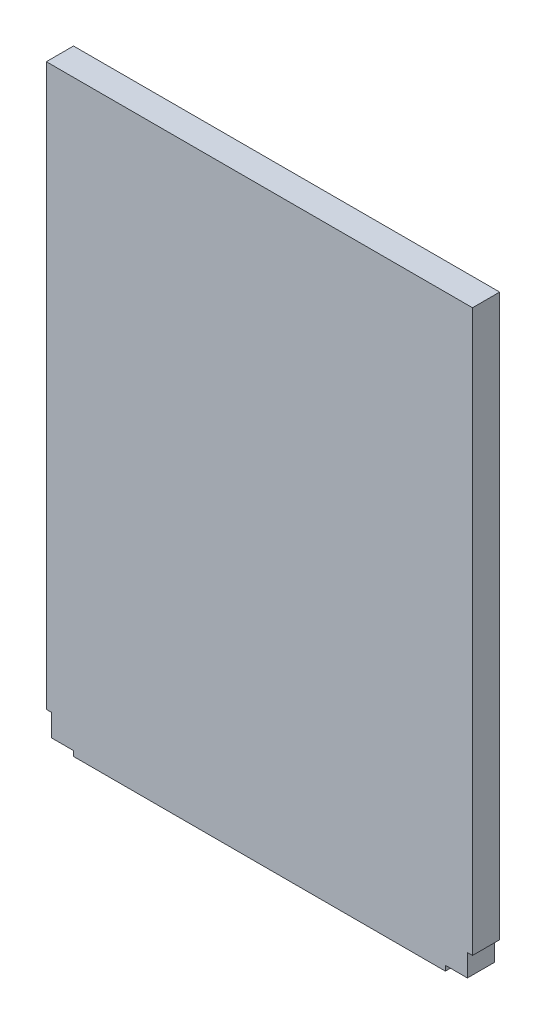
ISO-10303-21;
HEADER;
FILE_DESCRIPTION(('STEP AP214'),'2;1');
FILE_NAME('part.step','',(''),(''),'','','');
FILE_SCHEMA(('AUTOMOTIVE_DESIGN { 1 0 10303 214 1 1 1 1 }'));
ENDSEC;
DATA;
#1=APPLICATION_CONTEXT('core data for automotive mechanical design processes');
#2=APPLICATION_PROTOCOL_DEFINITION('international standard','automotive_design',2000,#1);
#3=PRODUCT_CONTEXT('',#1,'mechanical');
#4=PRODUCT('Part','Part','',(#3));
#5=PRODUCT_RELATED_PRODUCT_CATEGORY('part','',(#4));
#6=PRODUCT_DEFINITION_FORMATION('','',#4);
#7=PRODUCT_DEFINITION_CONTEXT('part definition',#1,'design');
#8=PRODUCT_DEFINITION('design','',#6,#7);
#9=PRODUCT_DEFINITION_SHAPE('','',#8);
#10=(LENGTH_UNIT() NAMED_UNIT(*) SI_UNIT(.MILLI.,.METRE.));
#11=(NAMED_UNIT(*) PLANE_ANGLE_UNIT() SI_UNIT($,.RADIAN.));
#12=(NAMED_UNIT(*) SI_UNIT($,.STERADIAN.) SOLID_ANGLE_UNIT());
#13=UNCERTAINTY_MEASURE_WITH_UNIT(LENGTH_MEASURE(1.E-05),#10,'distance_accuracy_value','');
#14=(GEOMETRIC_REPRESENTATION_CONTEXT(3) GLOBAL_UNCERTAINTY_ASSIGNED_CONTEXT((#13)) GLOBAL_UNIT_ASSIGNED_CONTEXT((#10,
#11,#12)) REPRESENTATION_CONTEXT('',''));
#15=CARTESIAN_POINT('',(0.,0.,0.));
#16=DIRECTION('',(0.,0.,1.));
#17=DIRECTION('',(1.,0.,0.));
#18=AXIS2_PLACEMENT_3D('',#15,#16,#17);
#19=CARTESIAN_POINT('',(0.,0.,50.8));
#20=DIRECTION('',(1.,0.,0.));
#21=DIRECTION('',(0.,0.,-1.));
#22=AXIS2_PLACEMENT_3D('',#19,#20,#21);
#23=PLANE('',#22);
#24=DIRECTION('',(0.,-1.,0.));
#25=VECTOR('',#24,1.);
#26=CARTESIAN_POINT('',(0.,0.,0.));
#27=LINE('',#26,#25);
#28=CARTESIAN_POINT('',(0.,0.,0.));
#29=VERTEX_POINT('',#28);
#30=CARTESIAN_POINT('',(0.,-1049.2,0.));
#31=VERTEX_POINT('',#30);
#32=EDGE_CURVE('E156',#29,#31,#27,.T.);
#33=ORIENTED_EDGE('',*,*,#32,.T.);
#34=DIRECTION('',(0.,0.,1.));
#35=VECTOR('',#34,1.);
#36=CARTESIAN_POINT('',(0.,-1049.2,-0.199999999999999));
#37=LINE('',#36,#35);
#38=CARTESIAN_POINT('',(0.,-1049.2,50.8));
#39=VERTEX_POINT('',#38);
#40=EDGE_CURVE('E160',#31,#39,#37,.T.);
#41=ORIENTED_EDGE('',*,*,#40,.T.);
#42=DIRECTION('',(0.,-1.,0.));
#43=VECTOR('',#42,1.);
#44=CARTESIAN_POINT('',(0.,0.,50.8));
#45=LINE('',#44,#43);
#46=CARTESIAN_POINT('',(0.,0.,50.8));
#47=VERTEX_POINT('',#46);
#48=EDGE_CURVE('E152',#47,#39,#45,.T.);
#49=ORIENTED_EDGE('',*,*,#48,.F.);
#50=DIRECTION('',(0.,0.,-1.));
#51=VECTOR('',#50,1.);
#52=CARTESIAN_POINT('',(0.,0.,50.8));
#53=LINE('',#52,#51);
#54=EDGE_CURVE('E149',#47,#29,#53,.T.);
#55=ORIENTED_EDGE('',*,*,#54,.T.);
#56=EDGE_LOOP('',(#33,#41,#49,#55));
#57=FACE_BOUND('',#56,.T.);
#58=ADVANCED_FACE('F35',(#57),#23,.F.);
#59=CARTESIAN_POINT('',(0.,-1100.,50.8));
#60=DIRECTION('',(0.,1.,0.));
#61=DIRECTION('',(0.,0.,1.));
#62=AXIS2_PLACEMENT_3D('',#59,#60,#61);
#63=PLANE('',#62);
#64=DIRECTION('',(1.,0.,0.));
#65=VECTOR('',#64,1.);
#66=CARTESIAN_POINT('',(0.,-1100.,0.));
#67=LINE('',#66,#65);
#68=CARTESIAN_POINT('',(50.8,-1100.,0.));
#69=VERTEX_POINT('',#68);
#70=CARTESIAN_POINT('',(746.3,-1100.,0.));
#71=VERTEX_POINT('',#70);
#72=EDGE_CURVE('E159',#69,#71,#67,.T.);
#73=ORIENTED_EDGE('',*,*,#72,.T.);
#74=DIRECTION('',(0.,0.,1.));
#75=VECTOR('',#74,1.);
#76=CARTESIAN_POINT('',(746.3,-1100.,-0.199999999999999));
#77=LINE('',#76,#75);
#78=CARTESIAN_POINT('',(746.3,-1100.,50.8));
#79=VERTEX_POINT('',#78);
#80=EDGE_CURVE('E199',#71,#79,#77,.T.);
#81=ORIENTED_EDGE('',*,*,#80,.T.);
#82=DIRECTION('',(1.,0.,0.));
#83=VECTOR('',#82,1.);
#84=CARTESIAN_POINT('',(0.,-1100.,50.8));
#85=LINE('',#84,#83);
#86=CARTESIAN_POINT('',(50.8,-1100.,50.8));
#87=VERTEX_POINT('',#86);
#88=EDGE_CURVE('E147',#87,#79,#85,.T.);
#89=ORIENTED_EDGE('',*,*,#88,.F.);
#90=DIRECTION('',(0.,0.,1.));
#91=VECTOR('',#90,1.);
#92=CARTESIAN_POINT('',(50.8,-1100.,-0.199999999999999));
#93=LINE('',#92,#91);
#94=EDGE_CURVE('E214',#69,#87,#93,.T.);
#95=ORIENTED_EDGE('',*,*,#94,.F.);
#96=EDGE_LOOP('',(#73,#81,#89,#95));
#97=FACE_BOUND('',#96,.T.);
#98=ADVANCED_FACE('F244',(#97),#63,.F.);
#99=CARTESIAN_POINT('',(797.1,0.,50.8));
#100=DIRECTION('',(-1.,0.,0.));
#101=DIRECTION('',(0.,-1.,0.));
#102=AXIS2_PLACEMENT_3D('',#99,#100,#101);
#103=PLANE('',#102);
#104=DIRECTION('',(0.,1.,0.));
#105=VECTOR('',#104,1.);
#106=CARTESIAN_POINT('',(797.1,0.,50.8));
#107=LINE('',#106,#105);
#108=CARTESIAN_POINT('',(797.1,-1049.2,50.8));
#109=VERTEX_POINT('',#108);
#110=CARTESIAN_POINT('',(797.1,0.,50.8));
#111=VERTEX_POINT('',#110);
#112=EDGE_CURVE('E136',#109,#111,#107,.T.);
#113=ORIENTED_EDGE('',*,*,#112,.F.);
#114=DIRECTION('',(0.,0.,1.));
#115=VECTOR('',#114,1.);
#116=CARTESIAN_POINT('',(797.1,-1049.2,-0.199999999999999));
#117=LINE('',#116,#115);
#118=CARTESIAN_POINT('',(797.1,-1049.2,0.));
#119=VERTEX_POINT('',#118);
#120=EDGE_CURVE('E121',#119,#109,#117,.T.);
#121=ORIENTED_EDGE('',*,*,#120,.F.);
#122=DIRECTION('',(0.,1.,0.));
#123=VECTOR('',#122,1.);
#124=CARTESIAN_POINT('',(797.1,0.,0.));
#125=LINE('',#124,#123);
#126=CARTESIAN_POINT('',(797.1,0.,0.));
#127=VERTEX_POINT('',#126);
#128=EDGE_CURVE('E163',#119,#127,#125,.T.);
#129=ORIENTED_EDGE('',*,*,#128,.T.);
#130=DIRECTION('',(0.,0.,-1.));
#131=VECTOR('',#130,1.);
#132=CARTESIAN_POINT('',(797.1,0.,50.8));
#133=LINE('',#132,#131);
#134=EDGE_CURVE('E144',#111,#127,#133,.T.);
#135=ORIENTED_EDGE('',*,*,#134,.F.);
#136=EDGE_LOOP('',(#113,#121,#129,#135));
#137=FACE_BOUND('',#136,.T.);
#138=ADVANCED_FACE('F142',(#137),#103,.F.);
#139=CARTESIAN_POINT('',(0.,0.,50.8));
#140=DIRECTION('',(0.,-1.,0.));
#141=DIRECTION('',(0.,0.,-1.));
#142=AXIS2_PLACEMENT_3D('',#139,#140,#141);
#143=PLANE('',#142);
#144=DIRECTION('',(-1.,0.,0.));
#145=VECTOR('',#144,1.);
#146=CARTESIAN_POINT('',(0.,0.,0.));
#147=LINE('',#146,#145);
#148=EDGE_CURVE('E165',#127,#29,#147,.T.);
#149=ORIENTED_EDGE('',*,*,#148,.T.);
#150=ORIENTED_EDGE('',*,*,#54,.F.);
#151=DIRECTION('',(-1.,0.,0.));
#152=VECTOR('',#151,1.);
#153=CARTESIAN_POINT('',(0.,0.,50.8));
#154=LINE('',#153,#152);
#155=EDGE_CURVE('E146',#111,#47,#154,.T.);
#156=ORIENTED_EDGE('',*,*,#155,.F.);
#157=ORIENTED_EDGE('',*,*,#134,.T.);
#158=EDGE_LOOP('',(#149,#150,#156,#157));
#159=FACE_BOUND('',#158,.T.);
#160=ADVANCED_FACE('F267',(#159),#143,.F.);
#161=CARTESIAN_POINT('',(0.,0.,50.8));
#162=DIRECTION('',(0.,0.,1.));
#163=DIRECTION('',(1.,0.,0.));
#164=AXIS2_PLACEMENT_3D('',#161,#162,#163);
#165=PLANE('',#164);
#166=DIRECTION('',(0.,-1.,0.));
#167=VECTOR('',#166,1.);
#168=CARTESIAN_POINT('',(746.3,-1090.475,50.8));
#169=LINE('',#168,#167);
#170=CARTESIAN_POINT('',(746.3,-1090.475,50.8));
#171=VERTEX_POINT('',#170);
#172=EDGE_CURVE('E131',#171,#79,#169,.T.);
#173=ORIENTED_EDGE('',*,*,#172,.F.);
#174=DIRECTION('',(-1.,0.,0.));
#175=VECTOR('',#174,1.);
#176=CARTESIAN_POINT('',(787.575,-1090.475,50.8));
#177=LINE('',#176,#175);
#178=CARTESIAN_POINT('',(787.575,-1090.475,50.8));
#179=VERTEX_POINT('',#178);
#180=EDGE_CURVE('E248',#179,#171,#177,.T.);
#181=ORIENTED_EDGE('',*,*,#180,.F.);
#182=DIRECTION('',(0.,-1.,0.));
#183=VECTOR('',#182,1.);
#184=CARTESIAN_POINT('',(787.575,-1049.2,50.8));
#185=LINE('',#184,#183);
#186=CARTESIAN_POINT('',(787.575,-1049.2,50.8));
#187=VERTEX_POINT('',#186);
#188=EDGE_CURVE('E140',#187,#179,#185,.T.);
#189=ORIENTED_EDGE('',*,*,#188,.F.);
#190=DIRECTION('',(-1.,0.,0.));
#191=VECTOR('',#190,1.);
#192=CARTESIAN_POINT('',(797.1,-1049.2,50.8));
#193=LINE('',#192,#191);
#194=EDGE_CURVE('E124',#109,#187,#193,.T.);
#195=ORIENTED_EDGE('',*,*,#194,.F.);
#196=ORIENTED_EDGE('',*,*,#112,.T.);
#197=ORIENTED_EDGE('',*,*,#155,.T.);
#198=ORIENTED_EDGE('',*,*,#48,.T.);
#199=DIRECTION('',(-1.,0.,0.));
#200=VECTOR('',#199,1.);
#201=CARTESIAN_POINT('',(0.,-1049.2,50.8));
#202=LINE('',#201,#200);
#203=CARTESIAN_POINT('',(9.525,-1049.2,50.8));
#204=VERTEX_POINT('',#203);
#205=EDGE_CURVE('E212',#204,#39,#202,.T.);
#206=ORIENTED_EDGE('',*,*,#205,.F.);
#207=DIRECTION('',(0.,1.,0.));
#208=VECTOR('',#207,1.);
#209=CARTESIAN_POINT('',(9.525,-1049.2,50.8));
#210=LINE('',#209,#208);
#211=CARTESIAN_POINT('',(9.52500000000001,-1090.475,50.8));
#212=VERTEX_POINT('',#211);
#213=EDGE_CURVE('E209',#212,#204,#210,.T.);
#214=ORIENTED_EDGE('',*,*,#213,.F.);
#215=DIRECTION('',(-1.,0.,0.));
#216=VECTOR('',#215,1.);
#217=CARTESIAN_POINT('',(9.52500000000001,-1090.475,50.8));
#218=LINE('',#217,#216);
#219=CARTESIAN_POINT('',(50.8,-1090.475,50.8));
#220=VERTEX_POINT('',#219);
#221=EDGE_CURVE('E206',#220,#212,#218,.T.);
#222=ORIENTED_EDGE('',*,*,#221,.F.);
#223=DIRECTION('',(0.,1.,0.));
#224=VECTOR('',#223,1.);
#225=CARTESIAN_POINT('',(50.8,-1090.475,50.8));
#226=LINE('',#225,#224);
#227=EDGE_CURVE('E204',#87,#220,#226,.T.);
#228=ORIENTED_EDGE('',*,*,#227,.F.);
#229=ORIENTED_EDGE('',*,*,#88,.T.);
#230=EDGE_LOOP('',(#173,#181,#189,#195,#196,#197,#198,#206,#214,#222,#228,#229));
#231=FACE_BOUND('',#230,.T.);
#232=ADVANCED_FACE('F135',(#231),#165,.T.);
#233=CARTESIAN_POINT('',(0.,0.,0.));
#234=DIRECTION('',(0.,0.,1.));
#235=DIRECTION('',(1.,0.,0.));
#236=AXIS2_PLACEMENT_3D('',#233,#234,#235);
#237=PLANE('',#236);
#238=DIRECTION('',(-1.,0.,0.));
#239=VECTOR('',#238,1.);
#240=CARTESIAN_POINT('',(0.,-1090.475,0.));
#241=LINE('',#240,#239);
#242=CARTESIAN_POINT('',(787.575,-1090.475,0.));
#243=VERTEX_POINT('',#242);
#244=CARTESIAN_POINT('',(746.3,-1090.475,0.));
#245=VERTEX_POINT('',#244);
#246=EDGE_CURVE('E42',#243,#245,#241,.T.);
#247=ORIENTED_EDGE('',*,*,#246,.T.);
#248=DIRECTION('',(0.,-1.,0.));
#249=VECTOR('',#248,1.);
#250=CARTESIAN_POINT('',(746.3,0.,0.));
#251=LINE('',#250,#249);
#252=EDGE_CURVE('E11',#245,#71,#251,.T.);
#253=ORIENTED_EDGE('',*,*,#252,.T.);
#254=ORIENTED_EDGE('',*,*,#72,.F.);
#255=DIRECTION('',(0.,1.,0.));
#256=VECTOR('',#255,1.);
#257=CARTESIAN_POINT('',(50.8,0.,0.));
#258=LINE('',#257,#256);
#259=CARTESIAN_POINT('',(50.8,-1090.475,0.));
#260=VERTEX_POINT('',#259);
#261=EDGE_CURVE('E170',#69,#260,#258,.T.);
#262=ORIENTED_EDGE('',*,*,#261,.T.);
#263=DIRECTION('',(-1.,0.,0.));
#264=VECTOR('',#263,1.);
#265=CARTESIAN_POINT('',(0.,-1090.475,0.));
#266=LINE('',#265,#264);
#267=CARTESIAN_POINT('',(9.52500000000001,-1090.475,0.));
#268=VERTEX_POINT('',#267);
#269=EDGE_CURVE('E173',#260,#268,#266,.T.);
#270=ORIENTED_EDGE('',*,*,#269,.T.);
#271=DIRECTION('',(0.,1.,0.));
#272=VECTOR('',#271,1.);
#273=CARTESIAN_POINT('',(9.52499999999982,0.,0.));
#274=LINE('',#273,#272);
#275=CARTESIAN_POINT('',(9.525,-1049.2,0.));
#276=VERTEX_POINT('',#275);
#277=EDGE_CURVE('E176',#268,#276,#274,.T.);
#278=ORIENTED_EDGE('',*,*,#277,.T.);
#279=DIRECTION('',(-1.,0.,0.));
#280=VECTOR('',#279,1.);
#281=CARTESIAN_POINT('',(0.,-1049.2,0.));
#282=LINE('',#281,#280);
#283=EDGE_CURVE('E179',#276,#31,#282,.T.);
#284=ORIENTED_EDGE('',*,*,#283,.T.);
#285=ORIENTED_EDGE('',*,*,#32,.F.);
#286=ORIENTED_EDGE('',*,*,#148,.F.);
#287=ORIENTED_EDGE('',*,*,#128,.F.);
#288=DIRECTION('',(-1.,0.,0.));
#289=VECTOR('',#288,1.);
#290=CARTESIAN_POINT('',(0.,-1049.2,0.));
#291=LINE('',#290,#289);
#292=CARTESIAN_POINT('',(787.575,-1049.2,0.));
#293=VERTEX_POINT('',#292);
#294=EDGE_CURVE('E127',#119,#293,#291,.T.);
#295=ORIENTED_EDGE('',*,*,#294,.T.);
#296=DIRECTION('',(0.,-1.,0.));
#297=VECTOR('',#296,1.);
#298=CARTESIAN_POINT('',(787.575,0.,0.));
#299=LINE('',#298,#297);
#300=EDGE_CURVE('E183',#293,#243,#299,.T.);
#301=ORIENTED_EDGE('',*,*,#300,.T.);
#302=EDGE_LOOP('',(#247,#253,#254,#262,#270,#278,#284,#285,#286,#287,#295,#301));
#303=FACE_BOUND('',#302,.T.);
#304=ADVANCED_FACE('F187',(#303),#237,.F.);
#305=CARTESIAN_POINT('',(0.,-1049.2,-0.199999999999999));
#306=DIRECTION('',(0.,1.,0.));
#307=DIRECTION('',(0.,0.,1.));
#308=AXIS2_PLACEMENT_3D('',#305,#306,#307);
#309=PLANE('',#308);
#310=DIRECTION('',(0.,0.,1.));
#311=VECTOR('',#310,1.);
#312=CARTESIAN_POINT('',(9.525,-1049.2,-0.199999999999999));
#313=LINE('',#312,#311);
#314=EDGE_CURVE('E217',#276,#204,#313,.T.);
#315=ORIENTED_EDGE('',*,*,#314,.T.);
#316=ORIENTED_EDGE('',*,*,#205,.T.);
#317=ORIENTED_EDGE('',*,*,#40,.F.);
#318=ORIENTED_EDGE('',*,*,#283,.F.);
#319=EDGE_LOOP('',(#315,#316,#317,#318));
#320=FACE_BOUND('',#319,.T.);
#321=ADVANCED_FACE('F230',(#320),#309,.F.);
#322=CARTESIAN_POINT('',(9.525,-1049.2,-0.199999999999999));
#323=DIRECTION('',(1.,0.,0.));
#324=DIRECTION('',(0.,1.,0.));
#325=AXIS2_PLACEMENT_3D('',#322,#323,#324);
#326=PLANE('',#325);
#327=DIRECTION('',(0.,0.,1.));
#328=VECTOR('',#327,1.);
#329=CARTESIAN_POINT('',(9.52500000000001,-1090.475,-0.199999999999999));
#330=LINE('',#329,#328);
#331=EDGE_CURVE('E219',#268,#212,#330,.T.);
#332=ORIENTED_EDGE('',*,*,#331,.T.);
#333=ORIENTED_EDGE('',*,*,#213,.T.);
#334=ORIENTED_EDGE('',*,*,#314,.F.);
#335=ORIENTED_EDGE('',*,*,#277,.F.);
#336=EDGE_LOOP('',(#332,#333,#334,#335));
#337=FACE_BOUND('',#336,.T.);
#338=ADVANCED_FACE('F235',(#337),#326,.F.);
#339=CARTESIAN_POINT('',(9.52500000000001,-1090.475,-0.199999999999999));
#340=DIRECTION('',(0.,1.,0.));
#341=DIRECTION('',(0.,0.,1.));
#342=AXIS2_PLACEMENT_3D('',#339,#340,#341);
#343=PLANE('',#342);
#344=DIRECTION('',(0.,0.,1.));
#345=VECTOR('',#344,1.);
#346=CARTESIAN_POINT('',(50.8,-1090.475,-0.199999999999999));
#347=LINE('',#346,#345);
#348=EDGE_CURVE('E57',#260,#220,#347,.T.);
#349=ORIENTED_EDGE('',*,*,#348,.T.);
#350=ORIENTED_EDGE('',*,*,#221,.T.);
#351=ORIENTED_EDGE('',*,*,#331,.F.);
#352=ORIENTED_EDGE('',*,*,#269,.F.);
#353=EDGE_LOOP('',(#349,#350,#351,#352));
#354=FACE_BOUND('',#353,.T.);
#355=ADVANCED_FACE('F237',(#354),#343,.F.);
#356=CARTESIAN_POINT('',(50.8,-1090.475,-0.199999999999999));
#357=DIRECTION('',(1.,0.,0.));
#358=DIRECTION('',(0.,0.,-1.));
#359=AXIS2_PLACEMENT_3D('',#356,#357,#358);
#360=PLANE('',#359);
#361=ORIENTED_EDGE('',*,*,#94,.T.);
#362=ORIENTED_EDGE('',*,*,#227,.T.);
#363=ORIENTED_EDGE('',*,*,#348,.F.);
#364=ORIENTED_EDGE('',*,*,#261,.F.);
#365=EDGE_LOOP('',(#361,#362,#363,#364));
#366=FACE_BOUND('',#365,.T.);
#367=ADVANCED_FACE('F252',(#366),#360,.F.);
#368=CARTESIAN_POINT('',(746.3,-1090.475,-0.199999999999999));
#369=DIRECTION('',(-1.,0.,0.));
#370=DIRECTION('',(0.,0.,1.));
#371=AXIS2_PLACEMENT_3D('',#368,#369,#370);
#372=PLANE('',#371);
#373=DIRECTION('',(0.,0.,1.));
#374=VECTOR('',#373,1.);
#375=CARTESIAN_POINT('',(746.3,-1090.475,-0.199999999999999));
#376=LINE('',#375,#374);
#377=EDGE_CURVE('E195',#245,#171,#376,.T.);
#378=ORIENTED_EDGE('',*,*,#377,.T.);
#379=ORIENTED_EDGE('',*,*,#172,.T.);
#380=ORIENTED_EDGE('',*,*,#80,.F.);
#381=ORIENTED_EDGE('',*,*,#252,.F.);
#382=EDGE_LOOP('',(#378,#379,#380,#381));
#383=FACE_BOUND('',#382,.T.);
#384=ADVANCED_FACE('F250',(#383),#372,.F.);
#385=CARTESIAN_POINT('',(787.575,-1090.475,-0.199999999999999));
#386=DIRECTION('',(0.,1.,0.));
#387=DIRECTION('',(0.,0.,1.));
#388=AXIS2_PLACEMENT_3D('',#385,#386,#387);
#389=PLANE('',#388);
#390=DIRECTION('',(0.,0.,1.));
#391=VECTOR('',#390,1.);
#392=CARTESIAN_POINT('',(787.575,-1090.475,-0.199999999999999));
#393=LINE('',#392,#391);
#394=EDGE_CURVE('E194',#243,#179,#393,.T.);
#395=ORIENTED_EDGE('',*,*,#394,.T.);
#396=ORIENTED_EDGE('',*,*,#180,.T.);
#397=ORIENTED_EDGE('',*,*,#377,.F.);
#398=ORIENTED_EDGE('',*,*,#246,.F.);
#399=EDGE_LOOP('',(#395,#396,#397,#398));
#400=FACE_BOUND('',#399,.T.);
#401=ADVANCED_FACE('F192',(#400),#389,.F.);
#402=CARTESIAN_POINT('',(787.575,-1049.2,-0.199999999999999));
#403=DIRECTION('',(-1.,0.,0.));
#404=DIRECTION('',(0.,0.,1.));
#405=AXIS2_PLACEMENT_3D('',#402,#403,#404);
#406=PLANE('',#405);
#407=DIRECTION('',(0.,0.,1.));
#408=VECTOR('',#407,1.);
#409=CARTESIAN_POINT('',(787.575,-1049.2,-0.199999999999999));
#410=LINE('',#409,#408);
#411=EDGE_CURVE('E49',#293,#187,#410,.T.);
#412=ORIENTED_EDGE('',*,*,#411,.T.);
#413=ORIENTED_EDGE('',*,*,#188,.T.);
#414=ORIENTED_EDGE('',*,*,#394,.F.);
#415=ORIENTED_EDGE('',*,*,#300,.F.);
#416=EDGE_LOOP('',(#412,#413,#414,#415));
#417=FACE_BOUND('',#416,.T.);
#418=ADVANCED_FACE('F197',(#417),#406,.F.);
#419=CARTESIAN_POINT('',(797.1,-1049.2,-0.199999999999999));
#420=DIRECTION('',(0.,1.,0.));
#421=DIRECTION('',(0.,0.,1.));
#422=AXIS2_PLACEMENT_3D('',#419,#420,#421);
#423=PLANE('',#422);
#424=ORIENTED_EDGE('',*,*,#120,.T.);
#425=ORIENTED_EDGE('',*,*,#194,.T.);
#426=ORIENTED_EDGE('',*,*,#411,.F.);
#427=ORIENTED_EDGE('',*,*,#294,.F.);
#428=EDGE_LOOP('',(#424,#425,#426,#427));
#429=FACE_BOUND('',#428,.T.);
#430=ADVANCED_FACE('F123',(#429),#423,.F.);
#431=CLOSED_SHELL('',(#58,#98,#138,#160,#232,#304,#321,#338,#355,#367,#384,#401,#418,#430));
#432=MANIFOLD_SOLID_BREP('B2',#431);
#433=ADVANCED_BREP_SHAPE_REPRESENTATION('',(#18,#432),#14);
#434=SHAPE_DEFINITION_REPRESENTATION(#9,#433);
ENDSEC;
END-ISO-10303-21;
